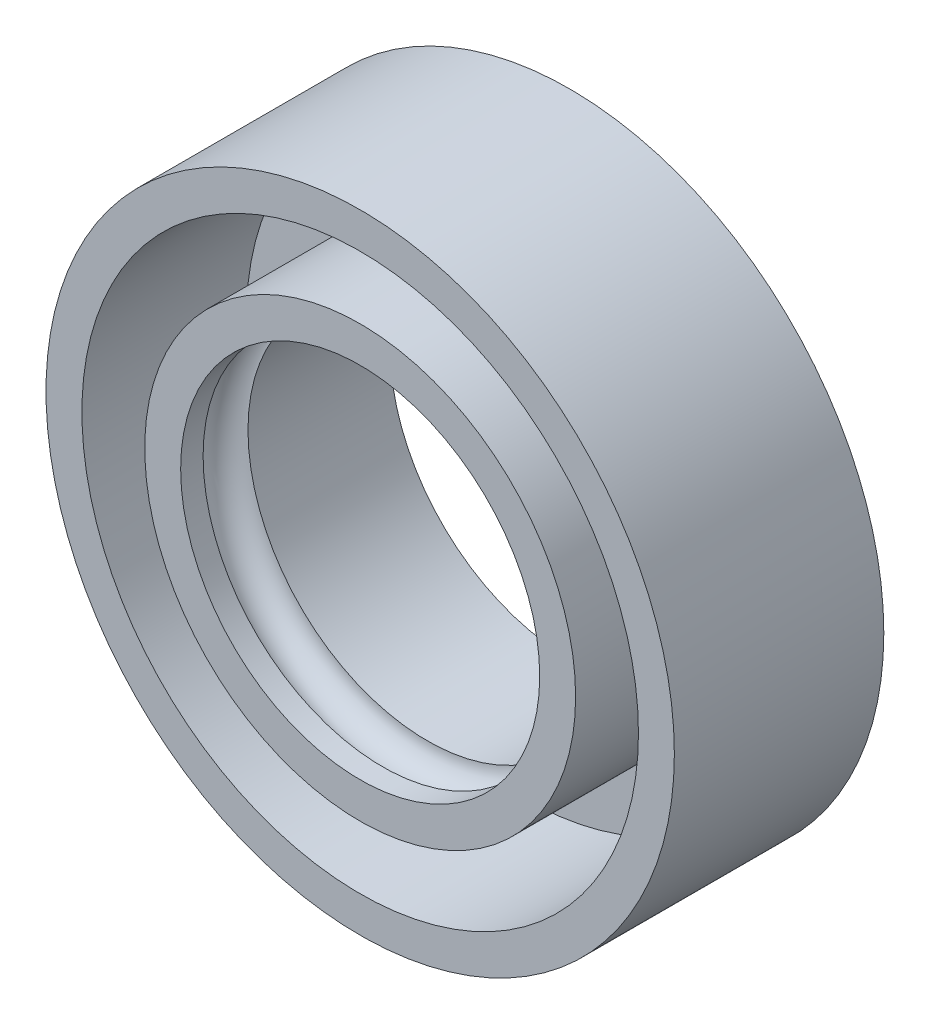
ISO-10303-21;
HEADER;
FILE_DESCRIPTION(('STEP AP214'),'2;1');
FILE_NAME('part.step','',(''),(''),'','','');
FILE_SCHEMA(('AUTOMOTIVE_DESIGN { 1 0 10303 214 1 1 1 1 }'));
ENDSEC;
DATA;
#1=APPLICATION_CONTEXT('core data for automotive mechanical design processes');
#2=APPLICATION_PROTOCOL_DEFINITION('international standard','automotive_design',2000,#1);
#3=PRODUCT_CONTEXT('',#1,'mechanical');
#4=PRODUCT('Part','Part','',(#3));
#5=PRODUCT_RELATED_PRODUCT_CATEGORY('part','',(#4));
#6=PRODUCT_DEFINITION_FORMATION('','',#4);
#7=PRODUCT_DEFINITION_CONTEXT('part definition',#1,'design');
#8=PRODUCT_DEFINITION('design','',#6,#7);
#9=PRODUCT_DEFINITION_SHAPE('','',#8);
#10=(LENGTH_UNIT() NAMED_UNIT(*) SI_UNIT(.MILLI.,.METRE.));
#11=(NAMED_UNIT(*) PLANE_ANGLE_UNIT() SI_UNIT($,.RADIAN.));
#12=(NAMED_UNIT(*) SI_UNIT($,.STERADIAN.) SOLID_ANGLE_UNIT());
#13=UNCERTAINTY_MEASURE_WITH_UNIT(LENGTH_MEASURE(1.E-05),#10,'distance_accuracy_value','');
#14=(GEOMETRIC_REPRESENTATION_CONTEXT(3) GLOBAL_UNCERTAINTY_ASSIGNED_CONTEXT((#13)) GLOBAL_UNIT_ASSIGNED_CONTEXT((#10,
#11,#12)) REPRESENTATION_CONTEXT('',''));
#15=CARTESIAN_POINT('',(0.,0.,0.));
#16=DIRECTION('',(0.,0.,1.));
#17=DIRECTION('',(1.,0.,0.));
#18=AXIS2_PLACEMENT_3D('',#15,#16,#17);
#19=CARTESIAN_POINT('',(0.,0.,0.));
#20=DIRECTION('',(0.,0.,1.));
#21=DIRECTION('',(1.,0.,0.));
#22=AXIS2_PLACEMENT_3D('',#19,#20,#21);
#23=CYLINDRICAL_SURFACE('',#22,6.);
#24=CARTESIAN_POINT('',(0.,0.,6.25));
#25=DIRECTION('',(0.,0.,-1.));
#26=DIRECTION('',(-1.,0.,0.));
#27=AXIS2_PLACEMENT_3D('',#24,#25,#26);
#28=CIRCLE('',#27,6.);
#29=CARTESIAN_POINT('',(6.,0.,6.25));
#30=VERTEX_POINT('',#29);
#31=EDGE_CURVE('E12',#30,#30,#28,.T.);
#32=ORIENTED_EDGE('',*,*,#31,.T.);
#33=EDGE_LOOP('',(#32));
#34=FACE_BOUND('',#33,.T.);
#35=CARTESIAN_POINT('',(0.,0.,7.));
#36=DIRECTION('',(0.,0.,1.));
#37=DIRECTION('',(1.,0.,0.));
#38=AXIS2_PLACEMENT_3D('',#35,#36,#37);
#39=CIRCLE('',#38,6.);
#40=CARTESIAN_POINT('',(6.,0.,7.));
#41=VERTEX_POINT('',#40);
#42=EDGE_CURVE('E94',#41,#41,#39,.T.);
#43=ORIENTED_EDGE('',*,*,#42,.T.);
#44=EDGE_LOOP('',(#43));
#45=FACE_BOUND('',#44,.T.);
#46=ADVANCED_FACE('F59',(#34,#45),#23,.F.);
#47=CARTESIAN_POINT('',(0.,0.,7.));
#48=DIRECTION('',(0.,0.,1.));
#49=DIRECTION('',(1.,0.,0.));
#50=AXIS2_PLACEMENT_3D('',#47,#48,#49);
#51=PLANE('',#50);
#52=ORIENTED_EDGE('',*,*,#42,.F.);
#53=EDGE_LOOP('',(#52));
#54=FACE_BOUND('',#53,.T.);
#55=CARTESIAN_POINT('',(0.,0.,7.));
#56=DIRECTION('',(0.,0.,1.));
#57=DIRECTION('',(1.,0.,0.));
#58=AXIS2_PLACEMENT_3D('',#55,#56,#57);
#59=CIRCLE('',#58,7.2);
#60=CARTESIAN_POINT('',(7.2,0.,7.));
#61=VERTEX_POINT('',#60);
#62=EDGE_CURVE('E79',#61,#61,#59,.T.);
#63=ORIENTED_EDGE('',*,*,#62,.T.);
#64=EDGE_LOOP('',(#63));
#65=FACE_BOUND('',#64,.T.);
#66=ADVANCED_FACE('F128',(#54,#65),#51,.T.);
#67=CARTESIAN_POINT('',(0.,0.,7.));
#68=DIRECTION('',(0.,0.,-1.));
#69=DIRECTION('',(-1.,0.,0.));
#70=AXIS2_PLACEMENT_3D('',#67,#68,#69);
#71=CYLINDRICAL_SURFACE('',#70,10.5);
#72=CARTESIAN_POINT('',(0.,0.,7.));
#73=DIRECTION('',(0.,0.,1.));
#74=DIRECTION('',(1.,0.,0.));
#75=AXIS2_PLACEMENT_3D('',#72,#73,#74);
#76=CIRCLE('',#75,10.5);
#77=CARTESIAN_POINT('',(10.5,0.,7.));
#78=VERTEX_POINT('',#77);
#79=EDGE_CURVE('E106',#78,#78,#76,.T.);
#80=ORIENTED_EDGE('',*,*,#79,.F.);
#81=EDGE_LOOP('',(#80));
#82=FACE_BOUND('',#81,.T.);
#83=CARTESIAN_POINT('',(0.,0.,0.));
#84=DIRECTION('',(0.,0.,1.));
#85=DIRECTION('',(1.,0.,0.));
#86=AXIS2_PLACEMENT_3D('',#83,#84,#85);
#87=CIRCLE('',#86,10.5);
#88=CARTESIAN_POINT('',(10.5,0.,0.));
#89=VERTEX_POINT('',#88);
#90=EDGE_CURVE('E102',#89,#89,#87,.T.);
#91=ORIENTED_EDGE('',*,*,#90,.T.);
#92=EDGE_LOOP('',(#91));
#93=FACE_BOUND('',#92,.T.);
#94=ADVANCED_FACE('F61',(#82,#93),#71,.T.);
#95=CARTESIAN_POINT('',(0.,0.,7.));
#96=DIRECTION('',(0.,0.,1.));
#97=DIRECTION('',(1.,0.,0.));
#98=AXIS2_PLACEMENT_3D('',#95,#96,#97);
#99=CIRCLE('',#98,9.3);
#100=CARTESIAN_POINT('',(9.3,0.,7.));
#101=VERTEX_POINT('',#100);
#102=EDGE_CURVE('E88',#101,#101,#99,.T.);
#103=ORIENTED_EDGE('',*,*,#102,.F.);
#104=EDGE_LOOP('',(#103));
#105=FACE_BOUND('',#104,.T.);
#106=ORIENTED_EDGE('',*,*,#79,.T.);
#107=EDGE_LOOP('',(#106));
#108=FACE_BOUND('',#107,.T.);
#109=ADVANCED_FACE('F124',(#105,#108),#51,.T.);
#110=CARTESIAN_POINT('',(0.,0.,0.));
#111=DIRECTION('',(0.,0.,1.));
#112=DIRECTION('',(1.,0.,0.));
#113=AXIS2_PLACEMENT_3D('',#110,#111,#112);
#114=PLANE('',#113);
#115=CARTESIAN_POINT('',(0.,0.,0.));
#116=DIRECTION('',(0.,0.,1.));
#117=DIRECTION('',(1.,0.,0.));
#118=AXIS2_PLACEMENT_3D('',#115,#116,#117);
#119=CIRCLE('',#118,6.);
#120=CARTESIAN_POINT('',(6.,0.,0.));
#121=VERTEX_POINT('',#120);
#122=EDGE_CURVE('E98',#121,#121,#119,.T.);
#123=ORIENTED_EDGE('',*,*,#122,.T.);
#124=EDGE_LOOP('',(#123));
#125=FACE_BOUND('',#124,.T.);
#126=ORIENTED_EDGE('',*,*,#90,.F.);
#127=EDGE_LOOP('',(#126));
#128=FACE_BOUND('',#127,.T.);
#129=ADVANCED_FACE('F118',(#125,#128),#114,.F.);
#130=CARTESIAN_POINT('',(0.,0.,4.75));
#131=DIRECTION('',(0.,0.,1.));
#132=DIRECTION('',(1.,0.,0.));
#133=AXIS2_PLACEMENT_3D('',#130,#131,#132);
#134=CIRCLE('',#133,6.);
#135=CARTESIAN_POINT('',(6.,0.,4.75));
#136=VERTEX_POINT('',#135);
#137=EDGE_CURVE('E68',#136,#136,#134,.T.);
#138=ORIENTED_EDGE('',*,*,#137,.T.);
#139=EDGE_LOOP('',(#138));
#140=FACE_BOUND('',#139,.T.);
#141=ORIENTED_EDGE('',*,*,#122,.F.);
#142=EDGE_LOOP('',(#141));
#143=FACE_BOUND('',#142,.T.);
#144=ADVANCED_FACE('F114',(#140,#143),#23,.F.);
#145=CARTESIAN_POINT('',(0.,0.,1.5));
#146=DIRECTION('',(0.,0.,1.));
#147=DIRECTION('',(1.,0.,0.));
#148=AXIS2_PLACEMENT_3D('',#145,#146,#147);
#149=CYLINDRICAL_SURFACE('',#148,9.3);
#150=CARTESIAN_POINT('',(0.,0.,1.5));
#151=DIRECTION('',(0.,0.,1.));
#152=DIRECTION('',(1.,0.,0.));
#153=AXIS2_PLACEMENT_3D('',#150,#151,#152);
#154=CIRCLE('',#153,9.3);
#155=CARTESIAN_POINT('',(9.3,0.,1.5));
#156=VERTEX_POINT('',#155);
#157=EDGE_CURVE('E90',#156,#156,#154,.T.);
#158=ORIENTED_EDGE('',*,*,#157,.F.);
#159=EDGE_LOOP('',(#158));
#160=FACE_BOUND('',#159,.T.);
#161=ORIENTED_EDGE('',*,*,#102,.T.);
#162=EDGE_LOOP('',(#161));
#163=FACE_BOUND('',#162,.T.);
#164=ADVANCED_FACE('F117',(#160,#163),#149,.F.);
#165=CARTESIAN_POINT('',(0.,0.,1.5));
#166=DIRECTION('',(0.,0.,1.));
#167=DIRECTION('',(1.,0.,0.));
#168=AXIS2_PLACEMENT_3D('',#165,#166,#167);
#169=PLANE('',#168);
#170=CARTESIAN_POINT('',(0.,0.,1.5));
#171=DIRECTION('',(0.,0.,1.));
#172=DIRECTION('',(1.,0.,0.));
#173=AXIS2_PLACEMENT_3D('',#170,#171,#172);
#174=CIRCLE('',#173,7.2);
#175=CARTESIAN_POINT('',(7.2,0.,1.5));
#176=VERTEX_POINT('',#175);
#177=EDGE_CURVE('E83',#176,#176,#174,.T.);
#178=ORIENTED_EDGE('',*,*,#177,.F.);
#179=EDGE_LOOP('',(#178));
#180=FACE_BOUND('',#179,.T.);
#181=ORIENTED_EDGE('',*,*,#157,.T.);
#182=EDGE_LOOP('',(#181));
#183=FACE_BOUND('',#182,.T.);
#184=ADVANCED_FACE('F147',(#180,#183),#169,.T.);
#185=CARTESIAN_POINT('',(0.,0.,1.5));
#186=DIRECTION('',(0.,0.,1.));
#187=DIRECTION('',(1.,0.,0.));
#188=AXIS2_PLACEMENT_3D('',#185,#186,#187);
#189=CYLINDRICAL_SURFACE('',#188,7.2);
#190=ORIENTED_EDGE('',*,*,#177,.T.);
#191=EDGE_LOOP('',(#190));
#192=FACE_BOUND('',#191,.T.);
#193=ORIENTED_EDGE('',*,*,#62,.F.);
#194=EDGE_LOOP('',(#193));
#195=FACE_BOUND('',#194,.T.);
#196=ADVANCED_FACE('F151',(#192,#195),#189,.T.);
#197=CARTESIAN_POINT('',(0.,0.,5.5));
#198=DIRECTION('',(0.,0.,1.));
#199=DIRECTION('',(1.,0.,0.));
#200=AXIS2_PLACEMENT_3D('',#197,#198,#199);
#201=TOROIDAL_SURFACE('',#200,6.,0.75);
#202=CARTESIAN_POINT('',(6.,0.,5.5));
#203=DIRECTION('',(0.,1.,0.));
#204=DIRECTION('',(0.,0.,1.));
#205=AXIS2_PLACEMENT_3D('',#202,#203,#204);
#206=CIRCLE('',#205,0.75);
#207=EDGE_CURVE('E75',#30,#136,#206,.T.);
#208=ORIENTED_EDGE('',*,*,#207,.T.);
#209=ORIENTED_EDGE('',*,*,#137,.F.);
#210=ORIENTED_EDGE('',*,*,#207,.F.);
#211=ORIENTED_EDGE('',*,*,#31,.F.);
#212=EDGE_LOOP('',(#208,#209,#210,#211));
#213=FACE_BOUND('',#212,.T.);
#214=ADVANCED_FACE('F76',(#213),#201,.F.);
#215=CLOSED_SHELL('',(#46,#66,#94,#109,#129,#144,#164,#184,#196,#214));
#216=MANIFOLD_SOLID_BREP('B2',#215);
#217=ADVANCED_BREP_SHAPE_REPRESENTATION('',(#18,#216),#14);
#218=SHAPE_DEFINITION_REPRESENTATION(#9,#217);
ENDSEC;
END-ISO-10303-21;
